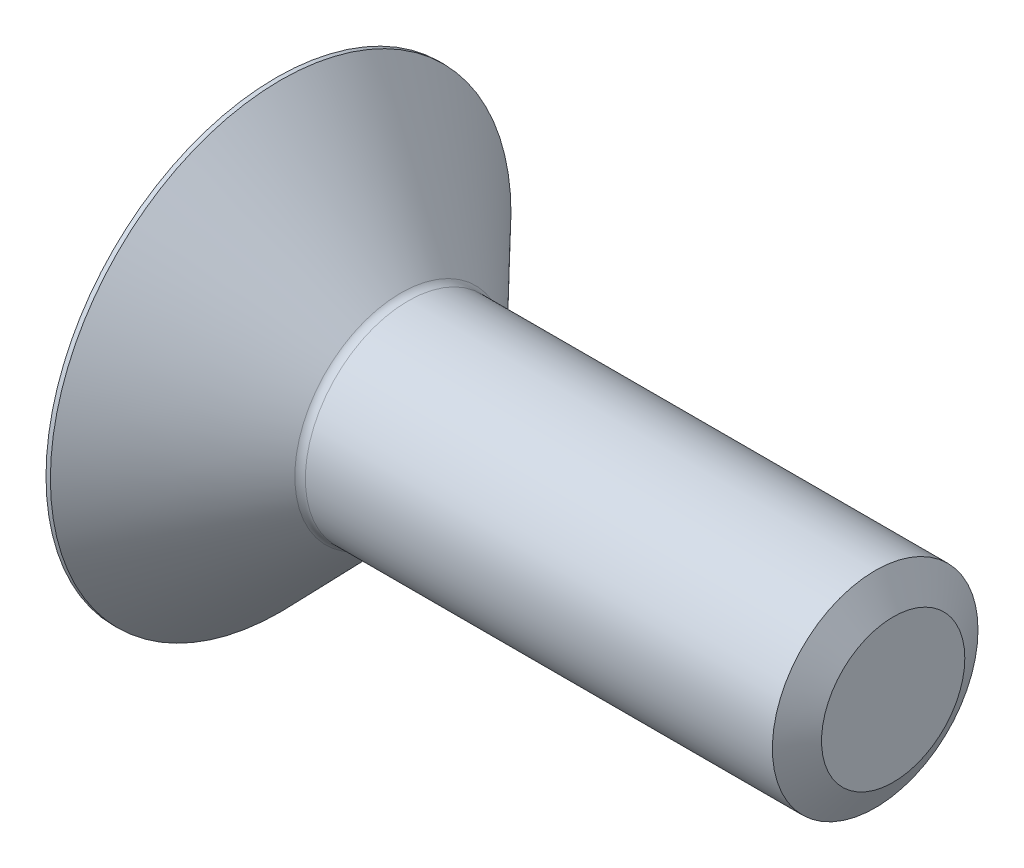
ISO-10303-21;
HEADER;
FILE_DESCRIPTION(('STEP AP214'),'2;1');
FILE_NAME('part.step','',(''),(''),'','','');
FILE_SCHEMA(('AUTOMOTIVE_DESIGN { 1 0 10303 214 1 1 1 1 }'));
ENDSEC;
DATA;
#1=APPLICATION_CONTEXT('core data for automotive mechanical design processes');
#2=APPLICATION_PROTOCOL_DEFINITION('international standard','automotive_design',2000,#1);
#3=PRODUCT_CONTEXT('',#1,'mechanical');
#4=PRODUCT('Part','Part','',(#3));
#5=PRODUCT_RELATED_PRODUCT_CATEGORY('part','',(#4));
#6=PRODUCT_DEFINITION_FORMATION('','',#4);
#7=PRODUCT_DEFINITION_CONTEXT('part definition',#1,'design');
#8=PRODUCT_DEFINITION('design','',#6,#7);
#9=PRODUCT_DEFINITION_SHAPE('','',#8);
#10=(LENGTH_UNIT() NAMED_UNIT(*) SI_UNIT(.MILLI.,.METRE.));
#11=(NAMED_UNIT(*) PLANE_ANGLE_UNIT() SI_UNIT($,.RADIAN.));
#12=(NAMED_UNIT(*) SI_UNIT($,.STERADIAN.) SOLID_ANGLE_UNIT());
#13=UNCERTAINTY_MEASURE_WITH_UNIT(LENGTH_MEASURE(1.E-05),#10,'distance_accuracy_value','');
#14=(GEOMETRIC_REPRESENTATION_CONTEXT(3) GLOBAL_UNCERTAINTY_ASSIGNED_CONTEXT((#13)) GLOBAL_UNIT_ASSIGNED_CONTEXT((#10,
#11,#12)) REPRESENTATION_CONTEXT('',''));
#15=CARTESIAN_POINT('',(0.,0.,0.));
#16=DIRECTION('',(0.,0.,1.));
#17=DIRECTION('',(1.,0.,0.));
#18=AXIS2_PLACEMENT_3D('',#15,#16,#17);
#19=CARTESIAN_POINT('',(0.,0.,0.));
#20=DIRECTION('',(1.,0.,0.));
#21=DIRECTION('',(0.,1.,0.));
#22=AXIS2_PLACEMENT_3D('',#19,#20,#21);
#23=CYLINDRICAL_SURFACE('',#22,2.);
#24=CARTESIAN_POINT('',(-9.43510503675808,0.,0.));
#25=DIRECTION('',(-1.,0.,0.));
#26=DIRECTION('',(0.,1.,0.));
#27=AXIS2_PLACEMENT_3D('',#24,#25,#26);
#28=CIRCLE('',#27,2.);
#29=CARTESIAN_POINT('',(-9.43510503675808,2.,0.));
#30=VERTEX_POINT('',#29);
#31=EDGE_CURVE('E117',#30,#30,#28,.T.);
#32=ORIENTED_EDGE('',*,*,#31,.F.);
#33=EDGE_LOOP('',(#32));
#34=FACE_BOUND('',#33,.T.);
#35=CARTESIAN_POINT('',(-0.35,0.,0.));
#36=DIRECTION('',(1.,0.,0.));
#37=DIRECTION('',(0.,0.,-1.));
#38=AXIS2_PLACEMENT_3D('',#35,#36,#37);
#39=CIRCLE('',#38,2.);
#40=CARTESIAN_POINT('',(-0.35,0.,-2.));
#41=VERTEX_POINT('',#40);
#42=EDGE_CURVE('E279',#41,#41,#39,.T.);
#43=ORIENTED_EDGE('',*,*,#42,.F.);
#44=EDGE_LOOP('',(#43));
#45=FACE_BOUND('',#44,.T.);
#46=ADVANCED_FACE('F47',(#34,#45),#23,.T.);
#47=CARTESIAN_POINT('',(-12.,4.48,0.));
#48=DIRECTION('',(-1.,0.,0.));
#49=DIRECTION('',(0.,-1.,0.));
#50=AXIS2_PLACEMENT_3D('',#47,#48,#49);
#51=PLANE('',#50);
#52=CARTESIAN_POINT('',(-12.,0.,0.));
#53=DIRECTION('',(-1.,0.,0.));
#54=DIRECTION('',(0.,1.,0.));
#55=AXIS2_PLACEMENT_3D('',#52,#53,#54);
#56=CIRCLE('',#55,4.48);
#57=CARTESIAN_POINT('',(-12.,4.48,0.));
#58=VERTEX_POINT('',#57);
#59=EDGE_CURVE('E151',#58,#58,#56,.T.);
#60=ORIENTED_EDGE('',*,*,#59,.T.);
#61=EDGE_LOOP('',(#60));
#62=FACE_BOUND('',#61,.T.);
#63=CARTESIAN_POINT('',(-12.,0.,0.));
#64=DIRECTION('',(1.,0.,0.));
#65=DIRECTION('',(0.,-1.,0.));
#66=AXIS2_PLACEMENT_3D('',#63,#64,#65);
#67=CIRCLE('',#66,1.44337567297406);
#68=CARTESIAN_POINT('',(-12.,-0.721687836487039,-1.24999999999999));
#69=VERTEX_POINT('',#68);
#70=CARTESIAN_POINT('',(-12.,-1.44337567297406,0.));
#71=VERTEX_POINT('',#70);
#72=EDGE_CURVE('E51',#69,#71,#67,.F.);
#73=ORIENTED_EDGE('',*,*,#72,.F.);
#74=CARTESIAN_POINT('',(-12.,0.721687836487035,-1.25));
#75=VERTEX_POINT('',#74);
#76=EDGE_CURVE('E133',#75,#69,#67,.F.);
#77=ORIENTED_EDGE('',*,*,#76,.F.);
#78=CARTESIAN_POINT('',(-12.,0.,0.));
#79=DIRECTION('',(1.,0.,0.));
#80=DIRECTION('',(0.,0.,-1.));
#81=AXIS2_PLACEMENT_3D('',#78,#79,#80);
#82=CIRCLE('',#81,1.44337567297406);
#83=CARTESIAN_POINT('',(-12.,1.44337567297406,0.));
#84=VERTEX_POINT('',#83);
#85=EDGE_CURVE('E138',#75,#84,#82,.T.);
#86=ORIENTED_EDGE('',*,*,#85,.T.);
#87=CARTESIAN_POINT('',(-12.,0.721687836487031,1.25));
#88=VERTEX_POINT('',#87);
#89=EDGE_CURVE('E148',#88,#84,#67,.F.);
#90=ORIENTED_EDGE('',*,*,#89,.F.);
#91=CARTESIAN_POINT('',(-12.,-0.721687836487038,1.24999999999999));
#92=VERTEX_POINT('',#91);
#93=EDGE_CURVE('E56',#92,#88,#67,.F.);
#94=ORIENTED_EDGE('',*,*,#93,.F.);
#95=EDGE_CURVE('E11',#71,#92,#67,.F.);
#96=ORIENTED_EDGE('',*,*,#95,.F.);
#97=EDGE_LOOP('',(#73,#77,#86,#90,#94,#96));
#98=FACE_BOUND('',#97,.T.);
#99=ADVANCED_FACE('F145',(#62,#98),#51,.T.);
#100=CARTESIAN_POINT('',(0.,0.,0.));
#101=DIRECTION('',(1.,0.,0.));
#102=DIRECTION('',(0.,1.,0.));
#103=AXIS2_PLACEMENT_3D('',#100,#101,#102);
#104=CYLINDRICAL_SURFACE('',#103,4.48);
#105=ORIENTED_EDGE('',*,*,#59,.F.);
#106=EDGE_LOOP('',(#105));
#107=FACE_BOUND('',#106,.T.);
#108=CARTESIAN_POINT('',(-11.9149081615215,0.,0.));
#109=DIRECTION('',(-1.,0.,0.));
#110=DIRECTION('',(0.,1.,0.));
#111=AXIS2_PLACEMENT_3D('',#108,#109,#110);
#112=CIRCLE('',#111,4.48);
#113=CARTESIAN_POINT('',(-11.9149081615215,4.48,0.));
#114=VERTEX_POINT('',#113);
#115=EDGE_CURVE('E155',#114,#114,#112,.T.);
#116=ORIENTED_EDGE('',*,*,#115,.T.);
#117=EDGE_LOOP('',(#116));
#118=FACE_BOUND('',#117,.T.);
#119=ADVANCED_FACE('F260',(#107,#118),#104,.T.);
#120=CARTESIAN_POINT('',(-9.57897299682581,0.,0.));
#121=DIRECTION('',(-1.,0.,0.));
#122=DIRECTION('',(0.,-1.,0.));
#123=AXIS2_PLACEMENT_3D('',#120,#121,#122);
#124=CONICAL_SURFACE('',#123,2.0610683259082,0.802851455917393);
#125=ORIENTED_EDGE('',*,*,#115,.F.);
#126=EDGE_LOOP('',(#125));
#127=FACE_BOUND('',#126,.T.);
#128=CARTESIAN_POINT('',(-9.57897299682581,0.,0.));
#129=DIRECTION('',(-1.,0.,0.));
#130=DIRECTION('',(0.,1.,0.));
#131=AXIS2_PLACEMENT_3D('',#128,#129,#130);
#132=CIRCLE('',#131,2.0610683259082);
#133=CARTESIAN_POINT('',(-9.57897299682581,2.0610683259082,0.));
#134=VERTEX_POINT('',#133);
#135=EDGE_CURVE('E254',#134,#134,#132,.T.);
#136=ORIENTED_EDGE('',*,*,#135,.T.);
#137=EDGE_LOOP('',(#136));
#138=FACE_BOUND('',#137,.T.);
#139=ADVANCED_FACE('F262',(#127,#138),#124,.T.);
#140=CARTESIAN_POINT('',(-9.43510503675808,0.,0.));
#141=DIRECTION('',(1.,0.,0.));
#142=DIRECTION('',(0.,1.,0.));
#143=AXIS2_PLACEMENT_3D('',#140,#141,#142);
#144=TOROIDAL_SURFACE('',#143,2.2,0.2);
#145=ORIENTED_EDGE('',*,*,#135,.F.);
#146=EDGE_LOOP('',(#145));
#147=FACE_BOUND('',#146,.T.);
#148=ORIENTED_EDGE('',*,*,#31,.T.);
#149=EDGE_LOOP('',(#148));
#150=FACE_BOUND('',#149,.T.);
#151=ADVANCED_FACE('F265',(#147,#150),#144,.F.);
#152=CARTESIAN_POINT('',(-11.63,0.,0.));
#153=DIRECTION('',(-1.,0.,0.));
#154=DIRECTION('',(0.,0.,-1.));
#155=AXIS2_PLACEMENT_3D('',#152,#153,#154);
#156=CONICAL_SURFACE('',#155,0.,1.31985626102756);
#157=CARTESIAN_POINT('',(-12.0000296035517,-0.721572366433196,-1.2502));
#158=CARTESIAN_POINT('',(-11.9923376245114,-0.751560236122212,-1.19825948608787));
#159=CARTESIAN_POINT('',(-11.9853558988612,-0.781597955311095,-1.14623263030924));
#160=CARTESIAN_POINT('',(-11.9730912390252,-0.841770545746217,-1.04201064645257));
#161=CARTESIAN_POINT('',(-11.9678089341386,-0.871905448817343,-0.989815463252219));
#162=CARTESIAN_POINT('',(-11.9592477971586,-0.932104975245321,-0.885546824887376));
#163=CARTESIAN_POINT('',(-11.9559596086559,-0.962169257021961,-0.833473961357168));
#164=CARTESIAN_POINT('',(-11.9515506008694,-1.0223329488635,-0.729267390316703));
#165=CARTESIAN_POINT('',(-11.9504293994002,-1.05243235179703,-0.677133695158351));
#166=CARTESIAN_POINT('',(-11.9504293994002,-1.11263115766407,-0.572866304841648));
#167=CARTESIAN_POINT('',(-11.9515506008694,-1.1427305605976,-0.520732609683296));
#168=CARTESIAN_POINT('',(-11.9559596086559,-1.20289425243914,-0.416526038642831));
#169=CARTESIAN_POINT('',(-11.9592477971586,-1.23295853421578,-0.364453175112623));
#170=CARTESIAN_POINT('',(-11.9678089341386,-1.29315806064376,-0.26018453674778));
#171=CARTESIAN_POINT('',(-11.9730912390252,-1.32329296371488,-0.207989353547427));
#172=CARTESIAN_POINT('',(-11.9853558988612,-1.38346555415,-0.103767369690762));
#173=CARTESIAN_POINT('',(-11.9923376245114,-1.41350327333889,-0.0517405139121311));
#174=CARTESIAN_POINT('',(-12.0000296035517,-1.4434911430279,0.000200000000000636));
#175=B_SPLINE_CURVE_WITH_KNOTS('',3,(#157,#158,#159,#160,#161,#162,#163,#164,#165,#166,#167,
#168,#169,#170,#171,#172,#173,#174),.UNSPECIFIED.,.F.,.F.,(4,2,2,2,2,2,2,2,4),(0.,
0.181409592460798,0.362886284169927,0.543504761741732,0.724091381228727,0.904678000715721,
1.08529647828753,1.26677316999666,1.44818276245745),.UNSPECIFIED.);
#176=EDGE_CURVE('E135',#69,#71,#175,.T.);
#177=ORIENTED_EDGE('',*,*,#176,.F.);
#178=ORIENTED_EDGE('',*,*,#72,.T.);
#179=EDGE_LOOP('',(#177,#178));
#180=FACE_BOUND('',#179,.T.);
#181=ADVANCED_FACE('F271',(#180),#156,.F.);
#182=CARTESIAN_POINT('',(-12.2099346759608,-1.88564456120835,-1.25));
#183=CARTESIAN_POINT('',(-12.1978717207745,-1.82917708754349,-1.25));
#184=CARTESIAN_POINT('',(-12.1859628504096,-1.77267667269393,-1.25));
#185=CARTESIAN_POINT('',(-12.1625309817601,-1.65959353764961,-1.25));
#186=CARTESIAN_POINT('',(-12.1510079994722,-1.603010814144,-1.25));
#187=CARTESIAN_POINT('',(-12.1171150456129,-1.43301680264336,-1.25));
#188=CARTESIAN_POINT('',(-12.0954436732374,-1.31946408431674,-1.25));
#189=CARTESIAN_POINT('',(-12.0550957638615,-1.09274070828191,-1.25));
#190=CARTESIAN_POINT('',(-12.0363969731699,-0.979574090955366,-1.25));
#191=CARTESIAN_POINT('',(-12.003262336561,-0.752620098792875,-1.25));
#192=CARTESIAN_POINT('',(-11.9888257054665,-0.638832842230004,-1.25));
#193=CARTESIAN_POINT('',(-11.9660896767951,-0.409425109562639,-1.25));
#194=CARTESIAN_POINT('',(-11.9578544497048,-0.293797778272156,-1.25));
#195=CARTESIAN_POINT('',(-11.9515679025367,-0.120164512833949,-1.25));
#196=CARTESIAN_POINT('',(-11.9504831645204,-0.0622627928260231,-1.25));
#197=CARTESIAN_POINT('',(-11.9503795328626,0.0535425644189861,-1.25));
#198=CARTESIAN_POINT('',(-11.9513606413614,0.111446201657993,-1.25));
#199=CARTESIAN_POINT('',(-11.9573598650352,0.285474295690509,-1.25));
#200=CARTESIAN_POINT('',(-11.9654487463716,0.401498867422989,-1.25));
#201=CARTESIAN_POINT('',(-11.9881044285232,0.632939913681974,-1.25));
#202=CARTESIAN_POINT('',(-12.0026754362916,0.748355943957415,-1.25));
#203=CARTESIAN_POINT('',(-12.0365518645555,0.980878548477109,-1.25));
#204=CARTESIAN_POINT('',(-12.0559479394114,1.09797147883435,-1.25));
#205=CARTESIAN_POINT('',(-12.0976947052346,1.33163516367125,-1.25));
#206=CARTESIAN_POINT('',(-12.1200458280615,1.44820583924764,-1.25));
#207=CARTESIAN_POINT('',(-12.1666691464839,1.68099121651053,-1.25));
#208=CARTESIAN_POINT('',(-12.1909418646661,1.79720581237231,-1.25));
#209=CARTESIAN_POINT('',(-12.2407644332383,2.02936144868274,-1.25));
#210=CARTESIAN_POINT('',(-12.2663143094632,2.14530248354797,-1.25));
#211=CARTESIAN_POINT('',(-12.3180065719477,2.37571314645443,-1.25));
#212=CARTESIAN_POINT('',(-12.3441393559828,2.4901849375717,-1.25));
#213=CARTESIAN_POINT('',(-12.3970181249437,2.71898894145419,-1.25));
#214=CARTESIAN_POINT('',(-12.4237641225597,2.83332115127916,-1.25));
#215=CARTESIAN_POINT('',(-12.4776683131006,3.06173187878166,-1.25));
#216=CARTESIAN_POINT('',(-12.504825927525,3.17581053326541,-1.25));
#217=CARTESIAN_POINT('',(-12.5594820608739,3.40388218756383,-1.25));
#218=CARTESIAN_POINT('',(-12.5869805684218,3.51787519010305,-1.25));
#219=CARTESIAN_POINT('',(-12.6145979060459,3.6318390658806,-1.25));
#220=B_SPLINE_CURVE_WITH_KNOTS('',3,(#182,#183,#184,#185,#186,#187,#188,#189,#190,#191,#192,
#193,#194,#195,#196,#197,#198,#199,#200,#201,#202,#203,#204,#205,#206,#207,#208,#209,#210,#211,
#212,#213,#214,#215,#216,#217,#218,#219),.UNSPECIFIED.,.F.,.F.,(4,2,2,2,2,2,2,2,2,2,2,2,2,2,2,2,
2,2,4),(0.,0.173224299011892,0.346455770052937,0.693239171255751,1.03728991151599,
1.38127723097017,1.72877689620779,1.90247833758137,2.07617995891236,2.42483219762295,
2.77371104535804,3.12971850172323,3.48577804372492,3.84193475261371,4.19809866891608,
4.55034691732847,4.90260246198638,5.25440194267348,5.60618971410929),.UNSPECIFIED.);
#221=EDGE_CURVE('E110',#75,#69,#220,.F.);
#222=ORIENTED_EDGE('',*,*,#221,.F.);
#223=ORIENTED_EDGE('',*,*,#76,.T.);
#224=EDGE_LOOP('',(#222,#223));
#225=FACE_BOUND('',#224,.T.);
#226=ADVANCED_FACE('F131',(#225),#156,.F.);
#227=CARTESIAN_POINT('',(-12.0000296035517,1.4434911430279,0.000199999999999889));
#228=CARTESIAN_POINT('',(-11.9923376245114,1.41350327333888,-0.0517405139121313));
#229=CARTESIAN_POINT('',(-11.9853558988612,1.38346555415,-0.103767369690762));
#230=CARTESIAN_POINT('',(-11.9730912390252,1.32329296371488,-0.207989353547427));
#231=CARTESIAN_POINT('',(-11.9678089341386,1.29315806064375,-0.260184536747781));
#232=CARTESIAN_POINT('',(-11.9592477971586,1.23295853421578,-0.364453175112623));
#233=CARTESIAN_POINT('',(-11.9559596086559,1.20289425243914,-0.416526038642832));
#234=CARTESIAN_POINT('',(-11.9515506008694,1.1427305605976,-0.520732609683297));
#235=CARTESIAN_POINT('',(-11.9504293994002,1.11263115766407,-0.572866304841648));
#236=CARTESIAN_POINT('',(-11.9504293994002,1.05243235179702,-0.677133695158351));
#237=CARTESIAN_POINT('',(-11.9515506008694,1.0223329488635,-0.729267390316703));
#238=CARTESIAN_POINT('',(-11.9559596086559,0.962169257021958,-0.833473961357168));
#239=CARTESIAN_POINT('',(-11.9592477971586,0.932104975245318,-0.885546824887376));
#240=CARTESIAN_POINT('',(-11.9678089341386,0.87190544881734,-0.989815463252219));
#241=CARTESIAN_POINT('',(-11.9730912390252,0.841770545746214,-1.04201064645257));
#242=CARTESIAN_POINT('',(-11.9853558988612,0.781597955311092,-1.14623263030924));
#243=CARTESIAN_POINT('',(-11.9923376245114,0.75156023612221,-1.19825948608787));
#244=CARTESIAN_POINT('',(-12.0000296035517,0.721572366433193,-1.2502));
#245=B_SPLINE_CURVE_WITH_KNOTS('',3,(#227,#228,#229,#230,#231,#232,#233,#234,#235,#236,#237,
#238,#239,#240,#241,#242,#243,#244),.UNSPECIFIED.,.F.,.F.,(4,2,2,2,2,2,2,2,4),(0.,
0.181409592460797,0.362886284169927,0.543504761741732,0.724091381228726,0.904678000715721,
1.08529647828753,1.26677316999666,1.44818276245745),.UNSPECIFIED.);
#246=EDGE_CURVE('E121',#84,#75,#245,.T.);
#247=ORIENTED_EDGE('',*,*,#246,.F.);
#248=ORIENTED_EDGE('',*,*,#85,.F.);
#249=EDGE_LOOP('',(#247,#248));
#250=FACE_BOUND('',#249,.T.);
#251=ADVANCED_FACE('F139',(#250),#156,.F.);
#252=CARTESIAN_POINT('',(-12.0000296035517,0.721572366433193,1.2502));
#253=CARTESIAN_POINT('',(-11.9923376245114,0.75156023612221,1.19825948608787));
#254=CARTESIAN_POINT('',(-11.9853558988612,0.781597955311092,1.14623263030924));
#255=CARTESIAN_POINT('',(-11.9730912390252,0.841770545746214,1.04201064645257));
#256=CARTESIAN_POINT('',(-11.9678089341386,0.87190544881734,0.989815463252219));
#257=CARTESIAN_POINT('',(-11.9592477971586,0.932104975245318,0.885546824887376));
#258=CARTESIAN_POINT('',(-11.9559596086559,0.962169257021958,0.833473961357168));
#259=CARTESIAN_POINT('',(-11.9515506008694,1.0223329488635,0.729267390316703));
#260=CARTESIAN_POINT('',(-11.9504293994002,1.05243235179702,0.677133695158352));
#261=CARTESIAN_POINT('',(-11.9504293994002,1.11263115766407,0.572866304841648));
#262=CARTESIAN_POINT('',(-11.9515506008694,1.1427305605976,0.520732609683297));
#263=CARTESIAN_POINT('',(-11.9559596086559,1.20289425243914,0.416526038642832));
#264=CARTESIAN_POINT('',(-11.9592477971586,1.23295853421578,0.364453175112624));
#265=CARTESIAN_POINT('',(-11.9678089341386,1.29315806064375,0.260184536747781));
#266=CARTESIAN_POINT('',(-11.9730912390252,1.32329296371488,0.207989353547427));
#267=CARTESIAN_POINT('',(-11.9853558988612,1.38346555415,0.103767369690762));
#268=CARTESIAN_POINT('',(-11.9923376245114,1.41350327333888,0.0517405139121312));
#269=CARTESIAN_POINT('',(-12.0000296035517,1.4434911430279,-0.000200000000000081));
#270=B_SPLINE_CURVE_WITH_KNOTS('',3,(#252,#253,#254,#255,#256,#257,#258,#259,#260,#261,#262,
#263,#264,#265,#266,#267,#268,#269),.UNSPECIFIED.,.F.,.F.,(4,2,2,2,2,2,2,2,4),(0.,
0.181409592460797,0.362886284169927,0.543504761741732,0.724091381228727,0.904678000715721,
1.08529647828753,1.26677316999666,1.44818276245745),.UNSPECIFIED.);
#271=EDGE_CURVE('E142',#88,#84,#270,.T.);
#272=ORIENTED_EDGE('',*,*,#271,.F.);
#273=ORIENTED_EDGE('',*,*,#89,.T.);
#274=EDGE_LOOP('',(#272,#273));
#275=FACE_BOUND('',#274,.T.);
#276=ADVANCED_FACE('F195',(#275),#156,.F.);
#277=CARTESIAN_POINT('',(-12.2099346759325,-1.885644561076,1.25));
#278=CARTESIAN_POINT('',(-12.1978717207476,-1.82917708741649,1.25));
#279=CARTESIAN_POINT('',(-12.1859628503841,-1.7726766725723,1.25));
#280=CARTESIAN_POINT('',(-12.1625309817374,-1.65959353753871,1.25));
#281=CARTESIAN_POINT('',(-12.1510079994509,-1.60301081403847,1.25));
#282=CARTESIAN_POINT('',(-12.1171150455956,-1.43301680255399,1.25));
#283=CARTESIAN_POINT('',(-12.0954436732229,-1.31946408423816,1.25));
#284=CARTESIAN_POINT('',(-12.0550957638519,-1.09274070822473,1.25));
#285=CARTESIAN_POINT('',(-12.0363969731627,-0.97957409090879,1.25));
#286=CARTESIAN_POINT('',(-12.0032623365578,-0.752620098767597,1.25));
#287=CARTESIAN_POINT('',(-11.988825705465,-0.638832842215426,1.25));
#288=CARTESIAN_POINT('',(-11.9660896767959,-0.409425109570647,1.25));
#289=CARTESIAN_POINT('',(-11.9578544497063,-0.293797778292056,1.25));
#290=CARTESIAN_POINT('',(-11.9515679025377,-0.120164512871692,1.25));
#291=CARTESIAN_POINT('',(-11.950483164521,-0.0622627928697106,1.25));
#292=CARTESIAN_POINT('',(-11.9503795328621,0.0535425643634282,1.25));
#293=CARTESIAN_POINT('',(-11.9513606413601,0.11144620159651,1.25));
#294=CARTESIAN_POINT('',(-11.9573598650309,0.285474295611227,1.25));
#295=CARTESIAN_POINT('',(-11.9654487463646,0.401498867331896,1.25));
#296=CARTESIAN_POINT('',(-11.9881044285101,0.632939913567422,1.25));
#297=CARTESIAN_POINT('',(-12.0026754362751,0.748355943831214,1.25));
#298=CARTESIAN_POINT('',(-12.0365518645336,0.980878548339565,1.25));
#299=CARTESIAN_POINT('',(-12.0559479393881,1.09797147869704,1.25));
#300=CARTESIAN_POINT('',(-12.097694705209,1.33163516353436,1.25));
#301=CARTESIAN_POINT('',(-12.1200458280349,1.44820583911091,1.25));
#302=CARTESIAN_POINT('',(-12.1666691464558,1.68099121637416,1.25));
#303=CARTESIAN_POINT('',(-12.1909418646374,1.79720581223611,1.25));
#304=CARTESIAN_POINT('',(-12.2407644332086,2.02936144854685,1.25));
#305=CARTESIAN_POINT('',(-12.2663143094331,2.14530248341221,1.25));
#306=CARTESIAN_POINT('',(-12.318006571917,2.37571314631909,1.25));
#307=CARTESIAN_POINT('',(-12.3441393559518,2.49018493743663,1.25));
#308=CARTESIAN_POINT('',(-12.3970181249123,2.71898894131965,1.25));
#309=CARTESIAN_POINT('',(-12.4237641225282,2.83332115114489,1.25));
#310=CARTESIAN_POINT('',(-12.4776683130688,3.06173187864781,1.25));
#311=CARTESIAN_POINT('',(-12.5048259274931,3.17581053313172,1.25));
#312=CARTESIAN_POINT('',(-12.5594820608418,3.40388218743046,1.25));
#313=CARTESIAN_POINT('',(-12.5869805683896,3.51787518996983,1.25));
#314=CARTESIAN_POINT('',(-12.6145979060137,3.63183906574753,1.25));
#315=B_SPLINE_CURVE_WITH_KNOTS('',3,(#277,#278,#279,#280,#281,#282,#283,#284,#285,#286,#287,
#288,#289,#290,#291,#292,#293,#294,#295,#296,#297,#298,#299,#300,#301,#302,#303,#304,#305,#306,
#307,#308,#309,#310,#311,#312,#313,#314),.UNSPECIFIED.,.F.,.F.,(4,2,2,2,2,2,2,2,2,2,2,2,2,2,2,2,
2,2,4),(0.,0.173224298995286,0.346455770019722,0.693239171189212,1.03728991141696,
1.38127723083866,1.72877689604066,1.90247833739643,2.07617995870963,2.42483219738435,
2.77371104508349,3.12971850144865,3.48577804345034,3.84193475233927,4.19809866864177,
4.55034691705482,4.90260246171338,5.25440194240087,5.60618971383707),.UNSPECIFIED.);
#316=EDGE_CURVE('E185',#92,#88,#315,.T.);
#317=ORIENTED_EDGE('',*,*,#316,.F.);
#318=ORIENTED_EDGE('',*,*,#93,.T.);
#319=EDGE_LOOP('',(#317,#318));
#320=FACE_BOUND('',#319,.T.);
#321=ADVANCED_FACE('F344',(#320),#156,.F.);
#322=CARTESIAN_POINT('',(-12.0000296035517,-1.4434911430279,-0.00019999999999943));
#323=CARTESIAN_POINT('',(-11.9923376245114,-1.41350327333889,0.0517405139121319));
#324=CARTESIAN_POINT('',(-11.9853558988612,-1.38346555415,0.103767369690763));
#325=CARTESIAN_POINT('',(-11.9730912390252,-1.32329296371488,0.207989353547427));
#326=CARTESIAN_POINT('',(-11.9678089341386,-1.29315806064376,0.260184536747781));
#327=CARTESIAN_POINT('',(-11.9592477971586,-1.23295853421578,0.364453175112624));
#328=CARTESIAN_POINT('',(-11.9559596086559,-1.20289425243914,0.416526038642832));
#329=CARTESIAN_POINT('',(-11.9515506008694,-1.1427305605976,0.520732609683297));
#330=CARTESIAN_POINT('',(-11.9504293994002,-1.11263115766407,0.572866304841649));
#331=CARTESIAN_POINT('',(-11.9504293994002,-1.05243235179703,0.677133695158352));
#332=CARTESIAN_POINT('',(-11.9515506008694,-1.0223329488635,0.729267390316703));
#333=CARTESIAN_POINT('',(-11.9559596086559,-0.962169257021961,0.833473961357168));
#334=CARTESIAN_POINT('',(-11.9592477971586,-0.932104975245321,0.885546824887376));
#335=CARTESIAN_POINT('',(-11.9678089341386,-0.871905448817343,0.989815463252219));
#336=CARTESIAN_POINT('',(-11.9730912390252,-0.841770545746217,1.04201064645257));
#337=CARTESIAN_POINT('',(-11.9853558988612,-0.781597955311095,1.14623263030924));
#338=CARTESIAN_POINT('',(-11.9923376245114,-0.751560236122212,1.19825948608787));
#339=CARTESIAN_POINT('',(-12.0000296035517,-0.721572366433196,1.2502));
#340=B_SPLINE_CURVE_WITH_KNOTS('',3,(#322,#323,#324,#325,#326,#327,#328,#329,#330,#331,#332,
#333,#334,#335,#336,#337,#338,#339),.UNSPECIFIED.,.F.,.F.,(4,2,2,2,2,2,2,2,4),(0.,
0.181409592460797,0.362886284169926,0.543504761741732,0.724091381228726,0.90467800071572,
1.08529647828753,1.26677316999665,1.44818276245745),.UNSPECIFIED.);
#341=EDGE_CURVE('E202',#71,#92,#340,.T.);
#342=ORIENTED_EDGE('',*,*,#341,.F.);
#343=ORIENTED_EDGE('',*,*,#95,.T.);
#344=EDGE_LOOP('',(#342,#343));
#345=FACE_BOUND('',#344,.T.);
#346=ADVANCED_FACE('F336',(#345),#156,.F.);
#347=CARTESIAN_POINT('',(-10.5,0.,0.));
#348=DIRECTION('',(-1.,0.,0.));
#349=DIRECTION('',(0.,0.,-1.));
#350=AXIS2_PLACEMENT_3D('',#347,#348,#349);
#351=CONICAL_SURFACE('',#350,1.44337567297406,1.0471975511966);
#352=CARTESIAN_POINT('',(-9.66666666666668,0.,0.));
#353=VERTEX_POINT('',#352);
#354=VERTEX_LOOP('',#353);
#355=FACE_BOUND('',#354,.T.);
#356=CARTESIAN_POINT('',(-10.9647941112469,-1.86893140246438,-1.25));
#357=CARTESIAN_POINT('',(-10.9388968387752,-1.81495202331948,-1.25));
#358=CARTESIAN_POINT('',(-10.913268622226,-1.76084125406821,-1.25));
#359=CARTESIAN_POINT('',(-10.8627027608805,-1.65228662710084,-1.25));
#360=CARTESIAN_POINT('',(-10.8377652403636,-1.59784271156478,-1.25));
#361=CARTESIAN_POINT('',(-10.7885939165755,-1.48823931743727,-1.25));
#362=CARTESIAN_POINT('',(-10.7643652996986,-1.43307750157608,-1.25));
#363=CARTESIAN_POINT('',(-10.7169950706884,-1.322291884876,-1.25));
#364=CARTESIAN_POINT('',(-10.6938534020354,-1.26666810823571,-1.25));
#365=CARTESIAN_POINT('',(-10.6483546132115,-1.15340083084339,-1.25));
#366=CARTESIAN_POINT('',(-10.6260338155954,-1.09574254299337,-1.25));
#367=CARTESIAN_POINT('',(-10.5832554770157,-0.979741083181771,-1.25));
#368=CARTESIAN_POINT('',(-10.5627981695306,-0.921397826430708,-1.25));
#369=CARTESIAN_POINT('',(-10.5050842377309,-0.745435524961061,-1.25));
#370=CARTESIAN_POINT('',(-10.47135021501,-0.626561938268991,-1.25));
#371=CARTESIAN_POINT('',(-10.4322204068367,-0.445873083728397,-1.25));
#372=CARTESIAN_POINT('',(-10.42109406062,-0.385304700204766,-1.25));
#373=CARTESIAN_POINT('',(-10.4034278522596,-0.263486592005966,-1.25));
#374=CARTESIAN_POINT('',(-10.3968876801734,-0.202236913658281,-1.25));
#375=CARTESIAN_POINT('',(-10.3889987810357,-0.0801324467114857,-1.25));
#376=CARTESIAN_POINT('',(-10.3875887912554,-0.0192817195873881,-1.25));
#377=CARTESIAN_POINT('',(-10.389916187898,0.102319232972277,-1.25));
#378=CARTESIAN_POINT('',(-10.3936538930481,0.163069451951552,-1.25));
#379=CARTESIAN_POINT('',(-10.4088980280863,0.312961599284804,-1.25));
#380=CARTESIAN_POINT('',(-10.4232612484972,0.401813056011363,-1.25));
#381=CARTESIAN_POINT('',(-10.4602998496175,0.577788147007398,-1.25));
#382=CARTESIAN_POINT('',(-10.4829852484746,0.664909564874818,-1.25));
#383=CARTESIAN_POINT('',(-10.521737453429,0.795209225202643,-1.25));
#384=CARTESIAN_POINT('',(-10.535622944966,0.839061002297504,-1.25));
#385=CARTESIAN_POINT('',(-10.5646784155354,0.926308087978065,-1.25));
#386=CARTESIAN_POINT('',(-10.5798475929484,0.969703662686594,-1.25));
#387=CARTESIAN_POINT('',(-10.6112501341956,1.05609633562206,-1.25));
#388=CARTESIAN_POINT('',(-10.6274833046304,1.09909350465343,-1.25));
#389=CARTESIAN_POINT('',(-10.6608382441348,1.18474903966884,-1.25));
#390=CARTESIAN_POINT('',(-10.6779601633366,1.22740734699801,-1.25));
#391=CARTESIAN_POINT('',(-10.7227614294772,1.33629459608889,-1.25));
#392=CARTESIAN_POINT('',(-10.7509693838226,1.40230581149779,-1.25));
#393=CARTESIAN_POINT('',(-10.8087450814145,1.53373213651375,-1.25));
#394=CARTESIAN_POINT('',(-10.8383129265288,1.59914720102263,-1.25));
#395=CARTESIAN_POINT('',(-10.9285769202908,1.7946968045205,-1.25));
#396=CARTESIAN_POINT('',(-10.990824273455,1.92411391038016,-1.25));
#397=CARTESIAN_POINT('',(-11.1179296231775,2.18184246931719,-1.25));
#398=CARTESIAN_POINT('',(-11.1827907350414,2.31015236758041,-1.25));
#399=CARTESIAN_POINT('',(-11.31418074581,2.56589305739078,-1.25));
#400=CARTESIAN_POINT('',(-11.3807094327218,2.69332395808158,-1.25));
#401=CARTESIAN_POINT('',(-11.5085820019272,2.93557826354771,-1.25));
#402=CARTESIAN_POINT('',(-11.5698225706953,3.05045639166053,-1.25));
#403=CARTESIAN_POINT('',(-11.6930014803272,3.27984311951902,-1.25));
#404=CARTESIAN_POINT('',(-11.7549398470138,3.39435170538628,-1.25));
#405=CARTESIAN_POINT('',(-11.8791811563467,3.62279327925392,-1.25));
#406=CARTESIAN_POINT('',(-11.9414827709679,3.7367269904863,-1.25));
#407=CARTESIAN_POINT('',(-12.0664914922261,3.96436406683005,-1.25));
#408=CARTESIAN_POINT('',(-12.1291985774721,4.07806744368399,-1.25));
#409=CARTESIAN_POINT('',(-12.1920543496595,4.19168806666669,-1.25));
#410=B_SPLINE_CURVE_WITH_KNOTS('',3,(#356,#357,#358,#359,#360,#361,#362,#363,#364,#365,#366,
#367,#368,#369,#370,#371,#372,#373,#374,#375,#376,#377,#378,#379,#380,#381,#382,#383,#384,#385,
#386,#387,#388,#389,#390,#391,#392,#393,#394,#395,#396,#397,#398,#399,#400,#401,#402,#403,#404,
#405,#406,#407,#408,#409),.UNSPECIFIED.,.F.,.F.,(4,2,2,2,2,2,2,2,2,2,2,2,2,2,2,2,2,2,2,2,2,2,2,
2,2,2,4),(0.,0.179612926792688,0.359257964740983,0.539992735858538,0.720718098634108,
0.906167782291709,1.09164066925558,1.46154014687423,1.64614554490065,1.83073846573361,
2.01311967500085,2.19551217717958,2.46497297803791,2.73475922301,2.87273702449913,
3.01062929039678,3.14849656109657,3.28638719734752,3.50172172684185,3.71707241315527,
4.14784491485955,4.57914698421607,5.01039449901239,5.40093821275166,5.79149642681542,
6.18106124320223,6.57060567267797),.UNSPECIFIED.);
#411=CARTESIAN_POINT('',(-10.5,-0.721687836487034,-1.25));
#412=VERTEX_POINT('',#411);
#413=CARTESIAN_POINT('',(-10.5,0.721687836487031,-1.25));
#414=VERTEX_POINT('',#413);
#415=EDGE_CURVE('E113',#412,#414,#410,.T.);
#416=ORIENTED_EDGE('',*,*,#415,.F.);
#417=CARTESIAN_POINT('',(-10.500066674666,-1.4434911430279,0.00020000000000057));
#418=CARTESIAN_POINT('',(-10.4817459147637,-1.41177538446487,-0.0547333052317647));
#419=CARTESIAN_POINT('',(-10.4650833062006,-1.3797858602394,-0.110140786500239));
#420=CARTESIAN_POINT('',(-10.4359973039458,-1.31525277575269,-0.221915367600339));
#421=CARTESIAN_POINT('',(-10.4235842019761,-1.28270806805992,-0.27828445484171));
#422=CARTESIAN_POINT('',(-10.404259687636,-1.21802202146378,-0.390323974086984));
#423=CARTESIAN_POINT('',(-10.3972196894474,-1.18589064048521,-0.445977158459229));
#424=CARTESIAN_POINT('',(-10.3888124326306,-1.12147653960455,-0.557545653908391));
#425=CARTESIAN_POINT('',(-10.3874382152047,-1.08919405413422,-0.6134605589376));
#426=CARTESIAN_POINT('',(-10.3902833373679,-1.02886247391297,-0.717957921181724));
#427=CARTESIAN_POINT('',(-10.39380409882,-1.00080438896118,-0.766555949881315));
#428=CARTESIAN_POINT('',(-10.4049671126993,-0.944871034195505,-0.863435362173238));
#429=CARTESIAN_POINT('',(-10.4126131855727,-0.916995958125021,-0.911716410192163));
#430=CARTESIAN_POINT('',(-10.4317294547005,-0.860947097873548,-1.00879588385404));
#431=CARTESIAN_POINT('',(-10.4432807569797,-0.832780414607291,-1.0575820103519));
#432=CARTESIAN_POINT('',(-10.4694983146939,-0.77686736545365,-1.1544262522921));
#433=CARTESIAN_POINT('',(-10.4841584021391,-0.749120282155142,-1.20248561032696));
#434=CARTESIAN_POINT('',(-10.500066674666,-0.721572366433196,-1.2502));
#435=B_SPLINE_CURVE_WITH_KNOTS('',3,(#417,#418,#419,#420,#421,#422,#423,#424,#425,#426,#427,
#428,#429,#430,#431,#432,#433,#434),.UNSPECIFIED.,.F.,.F.,(4,2,2,2,2,2,2,2,4),(0.,
0.198150821029559,0.39677819631522,0.590488617354399,0.783961049317181,0.952480056398646,
1.1211553973001,1.2935743034359,1.4656542697693),.UNSPECIFIED.);
#436=CARTESIAN_POINT('',(-10.5,-1.44337567297407,0.));
#437=VERTEX_POINT('',#436);
#438=EDGE_CURVE('E235',#437,#412,#435,.T.);
#439=ORIENTED_EDGE('',*,*,#438,.F.);
#440=CARTESIAN_POINT('',(-10.500066674666,-0.721572366433196,1.2502));
#441=CARTESIAN_POINT('',(-10.4817459147637,-0.753288124996231,1.19526669476823));
#442=CARTESIAN_POINT('',(-10.4650833062006,-0.785277649221704,1.13985921349976));
#443=CARTESIAN_POINT('',(-10.4359973039458,-0.849810733708404,1.02808463239966));
#444=CARTESIAN_POINT('',(-10.4235842019761,-0.882355441401183,0.97171554515829));
#445=CARTESIAN_POINT('',(-10.404259687636,-0.947041487997318,0.859676025913016));
#446=CARTESIAN_POINT('',(-10.3972196894474,-0.979172868975894,0.804022841540771));
#447=CARTESIAN_POINT('',(-10.3888124326306,-1.04358696985655,0.692454346091609));
#448=CARTESIAN_POINT('',(-10.3874382152047,-1.07586945532687,0.6365394410624));
#449=CARTESIAN_POINT('',(-10.3902833373679,-1.13620103554813,0.532042078818275));
#450=CARTESIAN_POINT('',(-10.39380409882,-1.16425912049992,0.483444050118685));
#451=CARTESIAN_POINT('',(-10.4049671126993,-1.22019247526559,0.386564637826762));
#452=CARTESIAN_POINT('',(-10.4126131855727,-1.24806755133608,0.338283589807837));
#453=CARTESIAN_POINT('',(-10.4317294547005,-1.30411641158755,0.241204116145958));
#454=CARTESIAN_POINT('',(-10.4432807569797,-1.33228309485381,0.192417989648101));
#455=CARTESIAN_POINT('',(-10.4694983146939,-1.38819614400745,0.0955737477078988));
#456=CARTESIAN_POINT('',(-10.4841584021391,-1.41594322730596,0.0475143896730367));
#457=CARTESIAN_POINT('',(-10.500066674666,-1.4434911430279,-0.000199999999999313));
#458=B_SPLINE_CURVE_WITH_KNOTS('',3,(#440,#441,#442,#443,#444,#445,#446,#447,#448,#449,#450,
#451,#452,#453,#454,#455,#456,#457),.UNSPECIFIED.,.F.,.F.,(4,2,2,2,2,2,2,2,4),(0.,
0.198150821029559,0.39677819631522,0.590488617354399,0.783961049317181,0.952480056398645,
1.1211553973001,1.2935743034359,1.4656542697693),.UNSPECIFIED.);
#459=CARTESIAN_POINT('',(-10.5,-0.721687836487033,1.25));
#460=VERTEX_POINT('',#459);
#461=EDGE_CURVE('E456',#460,#437,#458,.T.);
#462=ORIENTED_EDGE('',*,*,#461,.F.);
#463=CARTESIAN_POINT('',(-10.9647941109243,-1.86893140179217,1.25));
#464=CARTESIAN_POINT('',(-10.9388968384665,-1.81495202267025,1.25));
#465=CARTESIAN_POINT('',(-10.9132686219312,-1.76084125344197,1.25));
#466=CARTESIAN_POINT('',(-10.8627027606134,-1.65228662652066,1.25));
#467=CARTESIAN_POINT('',(-10.8377652401103,-1.59784271100767,1.25));
#468=CARTESIAN_POINT('',(-10.7885939163498,-1.48823931692675,1.25));
#469=CARTESIAN_POINT('',(-10.7643652994868,-1.43307750108907,1.25));
#470=CARTESIAN_POINT('',(-10.7169950705039,-1.32229188443621,1.25));
#471=CARTESIAN_POINT('',(-10.6938534018645,-1.26666810781962,1.25));
#472=CARTESIAN_POINT('',(-10.6483546130678,-1.15340083047608,1.25));
#473=CARTESIAN_POINT('',(-10.6260338154653,-1.09574254265115,1.25));
#474=CARTESIAN_POINT('',(-10.583255476912,-0.979741082890175,1.25));
#475=CARTESIAN_POINT('',(-10.5627981694397,-0.921397826164638,1.25));
#476=CARTESIAN_POINT('',(-10.5050842376762,-0.74543552477224,1.25));
#477=CARTESIAN_POINT('',(-10.4713502149769,-0.626561938132859,1.25));
#478=CARTESIAN_POINT('',(-10.4322204068282,-0.445873083681238,1.25));
#479=CARTESIAN_POINT('',(-10.4210940606189,-0.385304700192767,1.25));
#480=CARTESIAN_POINT('',(-10.4034278522676,-0.26348659206503,1.25));
#481=CARTESIAN_POINT('',(-10.3968876801832,-0.202236913753246,1.25));
#482=CARTESIAN_POINT('',(-10.3889987810428,-0.0801324468775844,1.25));
#483=CARTESIAN_POINT('',(-10.3875887912582,-0.0192817197887162,1.25));
#484=CARTESIAN_POINT('',(-10.3899161878862,0.102319232701152,1.25));
#485=CARTESIAN_POINT('',(-10.3936538930261,0.16306945164586,1.25));
#486=CARTESIAN_POINT('',(-10.4088980280361,0.312961598922924,1.25));
#487=CARTESIAN_POINT('',(-10.4232612484297,0.40181305562826,1.25));
#488=CARTESIAN_POINT('',(-10.4602998495149,0.577788146583199,1.25));
#489=CARTESIAN_POINT('',(-10.4829852483542,0.66490956443075,1.25));
#490=CARTESIAN_POINT('',(-10.5217374532821,0.795209224728794,1.25));
#491=CARTESIAN_POINT('',(-10.5356229448103,0.839061001813536,1.25));
#492=CARTESIAN_POINT('',(-10.5646784153621,0.926308087473956,1.25));
#493=CARTESIAN_POINT('',(-10.5798475927664,0.969703662172462,1.25));
#494=CARTESIAN_POINT('',(-10.6112501339966,1.05609633508794,1.25));
#495=CARTESIAN_POINT('',(-10.627483304423,1.09909350410934,1.25));
#496=CARTESIAN_POINT('',(-10.6608382439108,1.1847490391048,1.25));
#497=CARTESIAN_POINT('',(-10.6779601631043,1.22740734642399,1.25));
#498=CARTESIAN_POINT('',(-10.7227614292321,1.33629459550825,1.25));
#499=CARTESIAN_POINT('',(-10.7509693835735,1.40230581092029,1.25));
#500=CARTESIAN_POINT('',(-10.8087450811585,1.53373213594212,1.25));
#501=CARTESIAN_POINT('',(-10.8383129262699,1.59914720045375,1.25));
#502=CARTESIAN_POINT('',(-10.9285769200244,1.79469680395943,1.25));
#503=CARTESIAN_POINT('',(-10.9908242731852,1.92411390982369,1.25));
#504=CARTESIAN_POINT('',(-11.1179296229027,2.18184246876937,1.25));
#505=CARTESIAN_POINT('',(-11.182790734765,2.31015236703662,1.25));
#506=CARTESIAN_POINT('',(-11.3141807455314,2.56589305685455,1.25));
#507=CARTESIAN_POINT('',(-11.3807094324427,2.69332395754888,1.25));
#508=CARTESIAN_POINT('',(-11.5085820016458,2.93557826301822,1.25));
#509=CARTESIAN_POINT('',(-11.5698225704122,3.05045639113076,1.25));
#510=CARTESIAN_POINT('',(-11.6930014800409,3.27984311898855,1.25));
#511=CARTESIAN_POINT('',(-11.7549398467261,3.39435170485538,1.25));
#512=CARTESIAN_POINT('',(-11.8791811560561,3.62279327872168,1.25));
#513=CARTESIAN_POINT('',(-11.941482770676,3.73672698995313,1.25));
#514=CARTESIAN_POINT('',(-12.0664914919315,3.96436406629495,1.25));
#515=CARTESIAN_POINT('',(-12.1291985771761,4.07806744314788,1.25));
#516=CARTESIAN_POINT('',(-12.1920543493623,4.19168806612954,1.25));
#517=B_SPLINE_CURVE_WITH_KNOTS('',3,(#463,#464,#465,#466,#467,#468,#469,#470,#471,#472,#473,
#474,#475,#476,#477,#478,#479,#480,#481,#482,#483,#484,#485,#486,#487,#488,#489,#490,#491,#492,
#493,#494,#495,#496,#497,#498,#499,#500,#501,#502,#503,#504,#505,#506,#507,#508,#509,#510,#511,
#512,#513,#514,#515,#516),.UNSPECIFIED.,.F.,.F.,(4,2,2,2,2,2,2,2,2,2,2,2,2,2,2,2,2,2,2,2,2,2,2,
2,2,2,4),(0.,0.179612926712517,0.359257964580628,0.539992735616913,0.720718098311219,
0.906167781883883,1.09164066876279,1.46154014621251,1.64614554413148,1.83073846485713,
2.01311967401941,2.19551217609308,2.46497297688036,2.73475922178118,2.8727370232333,
3.01062928909398,3.14849655975688,3.2863871959709,3.5017217254691,3.71707241178641,
4.14784491349866,4.57914698286383,5.0103944976687,5.40093821140479,5.7914964254654,
6.18106124184772,6.57060567131894),.UNSPECIFIED.);
#518=CARTESIAN_POINT('',(-10.5,0.721687836487033,1.25));
#519=VERTEX_POINT('',#518);
#520=EDGE_CURVE('E127',#519,#460,#517,.F.);
#521=ORIENTED_EDGE('',*,*,#520,.F.);
#522=CARTESIAN_POINT('',(-10.500066674666,1.4434911430279,-0.000200000000000111));
#523=CARTESIAN_POINT('',(-10.4817459147637,1.41177538446487,0.0547333052317649));
#524=CARTESIAN_POINT('',(-10.4650833062006,1.37978586023939,0.110140786500239));
#525=CARTESIAN_POINT('',(-10.4359973039458,1.31525277575269,0.22191536760034));
#526=CARTESIAN_POINT('',(-10.4235842019761,1.28270806805991,0.27828445484171));
#527=CARTESIAN_POINT('',(-10.404259687636,1.21802202146378,0.390323974086984));
#528=CARTESIAN_POINT('',(-10.3972196894474,1.1858906404852,0.445977158459229));
#529=CARTESIAN_POINT('',(-10.3888124326306,1.12147653960455,0.557545653908391));
#530=CARTESIAN_POINT('',(-10.3874382152047,1.08919405413422,0.6134605589376));
#531=CARTESIAN_POINT('',(-10.3902833373679,1.02886247391297,0.717957921181725));
#532=CARTESIAN_POINT('',(-10.39380409882,1.00080438896118,0.766555949881315));
#533=CARTESIAN_POINT('',(-10.4049671126993,0.944871034195502,0.863435362173238));
#534=CARTESIAN_POINT('',(-10.4126131855727,0.916995958125019,0.911716410192163));
#535=CARTESIAN_POINT('',(-10.4317294547005,0.860947097873545,1.00879588385404));
#536=CARTESIAN_POINT('',(-10.4432807569797,0.832780414607289,1.0575820103519));
#537=CARTESIAN_POINT('',(-10.4694983146939,0.776867365453647,1.1544262522921));
#538=CARTESIAN_POINT('',(-10.4841584021391,0.749120282155139,1.20248561032696));
#539=CARTESIAN_POINT('',(-10.500066674666,0.721572366433193,1.2502));
#540=B_SPLINE_CURVE_WITH_KNOTS('',3,(#522,#523,#524,#525,#526,#527,#528,#529,#530,#531,#532,
#533,#534,#535,#536,#537,#538,#539),.UNSPECIFIED.,.F.,.F.,(4,2,2,2,2,2,2,2,4),(0.,
0.198150821029559,0.396778196315221,0.590488617354399,0.783961049317181,0.952480056398646,
1.1211553973001,1.2935743034359,1.4656542697693),.UNSPECIFIED.);
#541=CARTESIAN_POINT('',(-10.5,1.44337567297406,0.));
#542=VERTEX_POINT('',#541);
#543=EDGE_CURVE('E149',#542,#519,#540,.T.);
#544=ORIENTED_EDGE('',*,*,#543,.F.);
#545=CARTESIAN_POINT('',(-10.500066674666,0.721572366433193,-1.2502));
#546=CARTESIAN_POINT('',(-10.4817459147637,0.753288124996229,-1.19526669476823));
#547=CARTESIAN_POINT('',(-10.4650833062006,0.785277649221702,-1.13985921349976));
#548=CARTESIAN_POINT('',(-10.4359973039458,0.849810733708402,-1.02808463239966));
#549=CARTESIAN_POINT('',(-10.4235842019761,0.882355441401181,-0.97171554515829));
#550=CARTESIAN_POINT('',(-10.404259687636,0.947041487997316,-0.859676025913016));
#551=CARTESIAN_POINT('',(-10.3972196894474,0.979172868975892,-0.804022841540771));
#552=CARTESIAN_POINT('',(-10.3888124326306,1.04358696985655,-0.692454346091609));
#553=CARTESIAN_POINT('',(-10.3874382152047,1.07586945532687,-0.6365394410624));
#554=CARTESIAN_POINT('',(-10.3902833373679,1.13620103554812,-0.532042078818275));
#555=CARTESIAN_POINT('',(-10.39380409882,1.16425912049992,-0.483444050118685));
#556=CARTESIAN_POINT('',(-10.4049671126993,1.22019247526559,-0.386564637826762));
#557=CARTESIAN_POINT('',(-10.4126131855727,1.24806755133608,-0.338283589807837));
#558=CARTESIAN_POINT('',(-10.4317294547005,1.30411641158755,-0.241204116145958));
#559=CARTESIAN_POINT('',(-10.4432807569797,1.33228309485381,-0.192417989648101));
#560=CARTESIAN_POINT('',(-10.4694983146939,1.38819614400745,-0.0955737477078984));
#561=CARTESIAN_POINT('',(-10.4841584021391,1.41594322730596,-0.047514389673036));
#562=CARTESIAN_POINT('',(-10.500066674666,1.4434911430279,0.000199999999999954));
#563=B_SPLINE_CURVE_WITH_KNOTS('',3,(#545,#546,#547,#548,#549,#550,#551,#552,#553,#554,#555,
#556,#557,#558,#559,#560,#561,#562),.UNSPECIFIED.,.F.,.F.,(4,2,2,2,2,2,2,2,4),(0.,
0.198150821029559,0.396778196315221,0.590488617354399,0.783961049317181,0.952480056398646,
1.1211553973001,1.2935743034359,1.4656542697693),.UNSPECIFIED.);
#564=EDGE_CURVE('E234',#414,#542,#563,.T.);
#565=ORIENTED_EDGE('',*,*,#564,.F.);
#566=EDGE_LOOP('',(#416,#439,#462,#521,#544,#565));
#567=FACE_BOUND('',#566,.T.);
#568=ADVANCED_FACE('F164',(#355,#567),#351,.F.);
#569=CARTESIAN_POINT('',(-9.52,1.44337567297406,0.));
#570=DIRECTION('',(0.,0.866025403784439,0.5));
#571=DIRECTION('',(0.,0.5,-0.866025403784439));
#572=AXIS2_PLACEMENT_3D('',#569,#570,#571);
#573=PLANE('',#572);
#574=ORIENTED_EDGE('',*,*,#271,.T.);
#575=DIRECTION('',(-1.,0.,0.));
#576=VECTOR('',#575,1.);
#577=CARTESIAN_POINT('',(-9.52,1.44337567297406,0.));
#578=LINE('',#577,#576);
#579=EDGE_CURVE('E123',#542,#84,#578,.T.);
#580=ORIENTED_EDGE('',*,*,#579,.F.);
#581=ORIENTED_EDGE('',*,*,#543,.T.);
#582=DIRECTION('',(-1.,0.,0.));
#583=VECTOR('',#582,1.);
#584=CARTESIAN_POINT('',(-9.52,0.721687836487031,1.25));
#585=LINE('',#584,#583);
#586=EDGE_CURVE('E71',#519,#88,#585,.T.);
#587=ORIENTED_EDGE('',*,*,#586,.T.);
#588=EDGE_LOOP('',(#574,#580,#581,#587));
#589=FACE_BOUND('',#588,.T.);
#590=ADVANCED_FACE('F168',(#589),#573,.F.);
#591=CARTESIAN_POINT('',(-9.52,0.721687836487031,1.25));
#592=DIRECTION('',(0.,0.,1.));
#593=DIRECTION('',(0.,1.,0.));
#594=AXIS2_PLACEMENT_3D('',#591,#592,#593);
#595=PLANE('',#594);
#596=ORIENTED_EDGE('',*,*,#316,.T.);
#597=ORIENTED_EDGE('',*,*,#586,.F.);
#598=ORIENTED_EDGE('',*,*,#520,.T.);
#599=DIRECTION('',(-1.,0.,0.));
#600=VECTOR('',#599,1.);
#601=CARTESIAN_POINT('',(-9.52,-0.721687836487033,1.25));
#602=LINE('',#601,#600);
#603=EDGE_CURVE('E248',#460,#92,#602,.T.);
#604=ORIENTED_EDGE('',*,*,#603,.T.);
#605=EDGE_LOOP('',(#596,#597,#598,#604));
#606=FACE_BOUND('',#605,.T.);
#607=ADVANCED_FACE('F173',(#606),#595,.F.);
#608=CARTESIAN_POINT('',(-9.52,-0.721687836487033,1.25));
#609=DIRECTION('',(0.,-0.866025403784439,0.5));
#610=DIRECTION('',(0.,0.5,0.866025403784439));
#611=AXIS2_PLACEMENT_3D('',#608,#609,#610);
#612=PLANE('',#611);
#613=ORIENTED_EDGE('',*,*,#341,.T.);
#614=ORIENTED_EDGE('',*,*,#603,.F.);
#615=ORIENTED_EDGE('',*,*,#461,.T.);
#616=DIRECTION('',(-1.,0.,0.));
#617=VECTOR('',#616,1.);
#618=CARTESIAN_POINT('',(-9.52,-1.44337567297407,0.));
#619=LINE('',#618,#617);
#620=EDGE_CURVE('E63',#437,#71,#619,.T.);
#621=ORIENTED_EDGE('',*,*,#620,.T.);
#622=EDGE_LOOP('',(#613,#614,#615,#621));
#623=FACE_BOUND('',#622,.T.);
#624=ADVANCED_FACE('F310',(#623),#612,.F.);
#625=CARTESIAN_POINT('',(-9.52,-1.44337567297407,0.));
#626=DIRECTION('',(0.,-0.866025403784439,-0.5));
#627=DIRECTION('',(0.,-0.5,0.866025403784439));
#628=AXIS2_PLACEMENT_3D('',#625,#626,#627);
#629=PLANE('',#628);
#630=ORIENTED_EDGE('',*,*,#176,.T.);
#631=ORIENTED_EDGE('',*,*,#620,.F.);
#632=ORIENTED_EDGE('',*,*,#438,.T.);
#633=DIRECTION('',(-1.,0.,0.));
#634=VECTOR('',#633,1.);
#635=CARTESIAN_POINT('',(-9.52,-0.721687836487033,-1.25));
#636=LINE('',#635,#634);
#637=EDGE_CURVE('E118',#412,#69,#636,.T.);
#638=ORIENTED_EDGE('',*,*,#637,.T.);
#639=EDGE_LOOP('',(#630,#631,#632,#638));
#640=FACE_BOUND('',#639,.T.);
#641=ADVANCED_FACE('F224',(#640),#629,.F.);
#642=CARTESIAN_POINT('',(-9.52,-0.721687836487033,-1.25));
#643=DIRECTION('',(0.,0.,-1.));
#644=DIRECTION('',(0.,-1.,0.));
#645=AXIS2_PLACEMENT_3D('',#642,#643,#644);
#646=PLANE('',#645);
#647=ORIENTED_EDGE('',*,*,#221,.T.);
#648=ORIENTED_EDGE('',*,*,#637,.F.);
#649=ORIENTED_EDGE('',*,*,#415,.T.);
#650=DIRECTION('',(-1.,0.,0.));
#651=VECTOR('',#650,1.);
#652=CARTESIAN_POINT('',(-9.52,0.721687836487031,-1.25));
#653=LINE('',#652,#651);
#654=EDGE_CURVE('E106',#414,#75,#653,.T.);
#655=ORIENTED_EDGE('',*,*,#654,.T.);
#656=EDGE_LOOP('',(#647,#648,#649,#655));
#657=FACE_BOUND('',#656,.T.);
#658=ADVANCED_FACE('F108',(#657),#646,.F.);
#659=CARTESIAN_POINT('',(-9.52,0.721687836487031,-1.25));
#660=DIRECTION('',(0.,0.866025403784439,-0.5));
#661=DIRECTION('',(0.,-0.5,-0.866025403784438));
#662=AXIS2_PLACEMENT_3D('',#659,#660,#661);
#663=PLANE('',#662);
#664=ORIENTED_EDGE('',*,*,#246,.T.);
#665=ORIENTED_EDGE('',*,*,#654,.F.);
#666=ORIENTED_EDGE('',*,*,#564,.T.);
#667=ORIENTED_EDGE('',*,*,#579,.T.);
#668=EDGE_LOOP('',(#664,#665,#666,#667));
#669=FACE_BOUND('',#668,.T.);
#670=ADVANCED_FACE('F122',(#669),#663,.F.);
#671=CARTESIAN_POINT('',(-0.35,0.,0.));
#672=DIRECTION('',(-1.,0.,0.));
#673=DIRECTION('',(0.,0.,-1.));
#674=AXIS2_PLACEMENT_3D('',#671,#672,#673);
#675=CONICAL_SURFACE('',#674,2.,1.0471975511966);
#676=CARTESIAN_POINT('',(0.,0.,0.));
#677=DIRECTION('',(1.,0.,0.));
#678=DIRECTION('',(0.,0.,-1.));
#679=AXIS2_PLACEMENT_3D('',#676,#677,#678);
#680=CIRCLE('',#679,1.39378221735089);
#681=CARTESIAN_POINT('',(0.,0.,-1.39378221735089));
#682=VERTEX_POINT('',#681);
#683=EDGE_CURVE('E143',#682,#682,#680,.T.);
#684=ORIENTED_EDGE('',*,*,#683,.F.);
#685=EDGE_LOOP('',(#684));
#686=FACE_BOUND('',#685,.T.);
#687=ORIENTED_EDGE('',*,*,#42,.T.);
#688=EDGE_LOOP('',(#687));
#689=FACE_BOUND('',#688,.T.);
#690=ADVANCED_FACE('F196',(#686,#689),#675,.T.);
#691=CARTESIAN_POINT('',(0.,0.,0.));
#692=DIRECTION('',(1.,0.,0.));
#693=DIRECTION('',(0.,1.,0.));
#694=AXIS2_PLACEMENT_3D('',#691,#692,#693);
#695=PLANE('',#694);
#696=ORIENTED_EDGE('',*,*,#683,.T.);
#697=EDGE_LOOP('',(#696));
#698=FACE_BOUND('',#697,.T.);
#699=ADVANCED_FACE('F49',(#698),#695,.T.);
#700=CLOSED_SHELL('',(#46,#99,#119,#139,#151,#181,#226,#251,#276,#321,#346,#568,#590,#607,#624,
#641,#658,#670,#690,#699));
#701=MANIFOLD_SOLID_BREP('B2',#700);
#702=ADVANCED_BREP_SHAPE_REPRESENTATION('',(#18,#701),#14);
#703=SHAPE_DEFINITION_REPRESENTATION(#9,#702);
ENDSEC;
END-ISO-10303-21;
